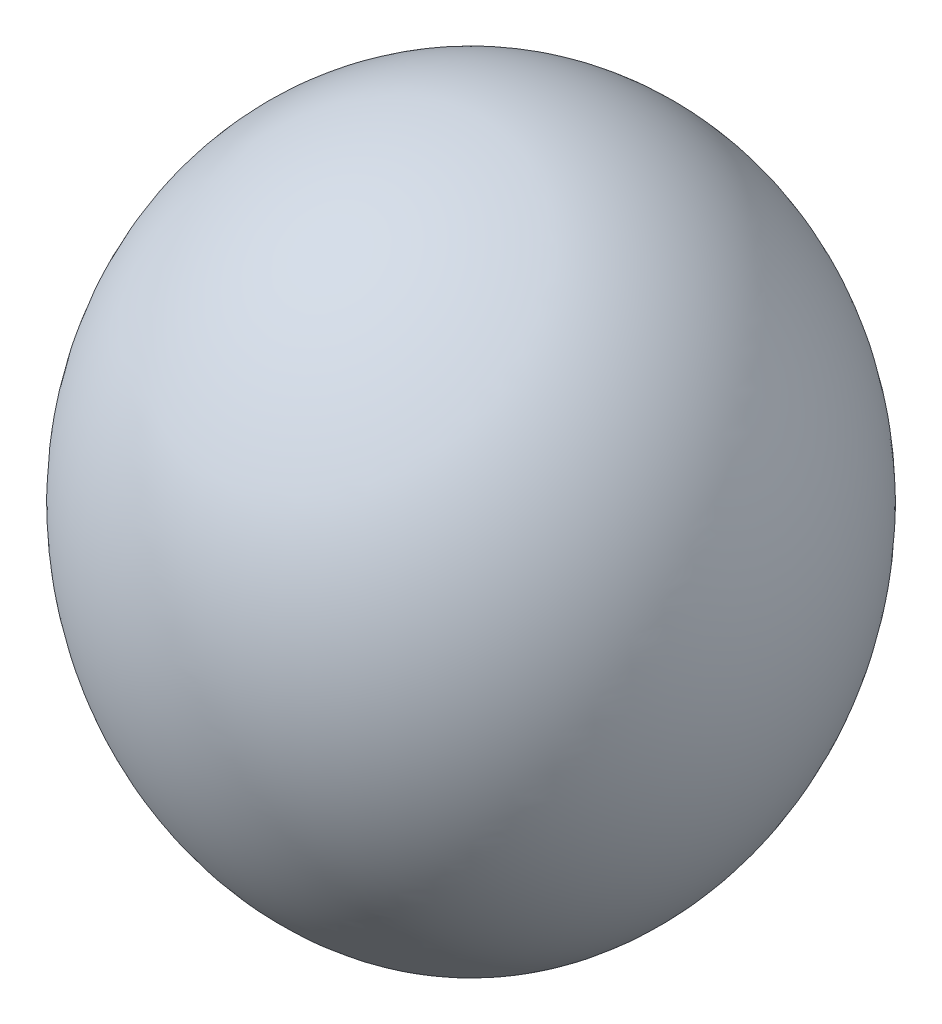
ISO-10303-21;
HEADER;
FILE_DESCRIPTION(('STEP AP214'),'2;1');
FILE_NAME('part.step','',(''),(''),'','','');
FILE_SCHEMA(('AUTOMOTIVE_DESIGN { 1 0 10303 214 1 1 1 1 }'));
ENDSEC;
DATA;
#1=APPLICATION_CONTEXT('core data for automotive mechanical design processes');
#2=APPLICATION_PROTOCOL_DEFINITION('international standard','automotive_design',2000,#1);
#3=PRODUCT_CONTEXT('',#1,'mechanical');
#4=PRODUCT('Part','Part','',(#3));
#5=PRODUCT_RELATED_PRODUCT_CATEGORY('part','',(#4));
#6=PRODUCT_DEFINITION_FORMATION('','',#4);
#7=PRODUCT_DEFINITION_CONTEXT('part definition',#1,'design');
#8=PRODUCT_DEFINITION('design','',#6,#7);
#9=PRODUCT_DEFINITION_SHAPE('','',#8);
#10=(LENGTH_UNIT() NAMED_UNIT(*) SI_UNIT(.MILLI.,.METRE.));
#11=(NAMED_UNIT(*) PLANE_ANGLE_UNIT() SI_UNIT($,.RADIAN.));
#12=(NAMED_UNIT(*) SI_UNIT($,.STERADIAN.) SOLID_ANGLE_UNIT());
#13=UNCERTAINTY_MEASURE_WITH_UNIT(LENGTH_MEASURE(1.E-05),#10,'distance_accuracy_value','');
#14=(GEOMETRIC_REPRESENTATION_CONTEXT(3) GLOBAL_UNCERTAINTY_ASSIGNED_CONTEXT((#13)) GLOBAL_UNIT_ASSIGNED_CONTEXT((#10,
#11,#12)) REPRESENTATION_CONTEXT('',''));
#15=CARTESIAN_POINT('',(0.,0.,0.));
#16=DIRECTION('',(0.,0.,1.));
#17=DIRECTION('',(1.,0.,0.));
#18=AXIS2_PLACEMENT_3D('',#15,#16,#17);
#19=CARTESIAN_POINT('',(1.41146710431532E-11,0.,0.));
#20=CARTESIAN_POINT('',(0.0859484376262017,-0.0282662684604244,0.));
#21=CARTESIAN_POINT('',(0.258741266043385,-0.0818126349667669,0.));
#22=CARTESIAN_POINT('',(0.607975906154392,-0.176773899432167,0.));
#23=CARTESIAN_POINT('',(1.13648443868247,-0.300694334369223,0.));
#24=CARTESIAN_POINT('',(1.75736046841581,-0.425492273985936,0.));
#25=CARTESIAN_POINT('',(2.47092487411519,-0.546444597975775,0.));
#26=CARTESIAN_POINT('',(3.18729849219299,-0.6491842073489,0.));
#27=CARTESIAN_POINT('',(3.90581284062354,-0.735687541069568,0.));
#28=CARTESIAN_POINT('',(4.62591371099559,-0.807603315987792,0.));
#29=CARTESIAN_POINT('',(5.76656639695076,-0.899989174711032,0.));
#30=CARTESIAN_POINT('',(7.32997146589355,-0.978373944070118,0.));
#31=CARTESIAN_POINT('',(9.31621460960801,-1.0015369923337,0.));
#32=CARTESIAN_POINT('',(11.7220271185774,-0.925628511429962,0.));
#33=CARTESIAN_POINT('',(14.3971716622839,-0.73790074574666,0.));
#34=CARTESIAN_POINT('',(17.3358932630275,-0.411989058645636,0.));
#35=CARTESIAN_POINT('',(20.5303576412977,0.0772355685000593,0.));
#36=CARTESIAN_POINT('',(23.9707996083012,0.753981371578221,0.));
#37=CARTESIAN_POINT('',(28.2347700624499,1.76756874603618,0.));
#38=CARTESIAN_POINT('',(33.2872704304692,3.23246337930188,0.));
#39=CARTESIAN_POINT('',(39.0780254717897,5.26931887182034,0.));
#40=CARTESIAN_POINT('',(45.539794960055,7.99882327547519,0.));
#41=CARTESIAN_POINT('',(53.1168259302294,11.7233962445402,0.));
#42=CARTESIAN_POINT('',(61.6611172805564,16.6752284001241,0.));
#43=CARTESIAN_POINT('',(74.1380836324685,25.2582387937832,0.));
#44=CARTESIAN_POINT('',(89.4923341094344,38.7566394707688,0.));
#45=CARTESIAN_POINT('',(105.334527051208,57.2109254431687,0.));
#46=CARTESIAN_POINT('',(120.029622867611,81.2294987615516,0.));
#47=CARTESIAN_POINT('',(130.843845704351,107.221766290394,0.));
#48=CARTESIAN_POINT('',(137.570745820491,134.558138538383,0.));
#49=CARTESIAN_POINT('',(140.025513533455,162.605947230255,0.));
#50=CARTESIAN_POINT('',(138.301043696831,187.186959393694,0.));
#51=CARTESIAN_POINT('',(133.992044155786,207.830556302757,0.));
#52=CARTESIAN_POINT('',(128.506752773258,224.498756482363,0.));
#53=CARTESIAN_POINT('',(122.98652847123,237.406769960268,0.));
#54=CARTESIAN_POINT('',(116.34720576717,249.777600476556,0.));
#55=CARTESIAN_POINT('',(109.579249051985,260.031141948827,0.));
#56=CARTESIAN_POINT('',(103.115808939633,268.337765834442,0.));
#57=CARTESIAN_POINT('',(96.1413567074445,276.213295476677,0.));
#58=CARTESIAN_POINT('',(88.6704255209011,283.627502930023,0.));
#59=CARTESIAN_POINT('',(79.671165034008,291.198206100322,0.));
#60=CARTESIAN_POINT('',(69.8927448485144,297.935366193862,0.));
#61=CARTESIAN_POINT('',(61.1222441539041,302.970615340565,0.));
#62=CARTESIAN_POINT('',(54.4052809333182,306.259537852515,0.));
#63=CARTESIAN_POINT('',(49.4752279922986,308.402261200091,0.));
#64=CARTESIAN_POINT('',(45.3967415433711,310.005002011626,0.));
#65=CARTESIAN_POINT('',(42.1007772880208,311.199361520453,0.));
#66=CARTESIAN_POINT('',(38.7739053085125,312.304684986551,0.));
#67=CARTESIAN_POINT('',(35.4184007172713,313.319846846936,0.));
#68=CARTESIAN_POINT('',(32.0366731147342,314.2438026592,0.));
#69=CARTESIAN_POINT('',(28.6310504400938,315.075592838871,0.));
#70=CARTESIAN_POINT('',(25.2041239903591,315.814346188175,0.));
#71=CARTESIAN_POINT('',(21.7581668819248,316.459283049553,0.));
#72=CARTESIAN_POINT('',(18.2960958721629,317.009718133361,0.));
#73=CARTESIAN_POINT('',(15.2543316251859,317.408144998869,0.));
#74=CARTESIAN_POINT('',(12.6407341636367,317.689916768168,0.));
#75=CARTESIAN_POINT('',(10.4579002422329,317.884780671021,0.));
#76=CARTESIAN_POINT('',(8.71145682890226,318.016662169121,0.));
#77=CARTESIAN_POINT('',(7.01718597563807,318.120951145697,0.));
#78=CARTESIAN_POINT('',(5.38617227190987,318.200188685147,0.));
#79=CARTESIAN_POINT('',(3.9899694364865,318.250002448526,0.));
#80=CARTESIAN_POINT('',(2.86155279063243,318.279563873678,0.));
#81=CARTESIAN_POINT('',(1.88839935742031,318.296619795261,0.));
#82=CARTESIAN_POINT('',(1.17505896639695,318.305716673976,0.));
#83=CARTESIAN_POINT('',(0.523129219152612,318.309128091201,0.));
#84=CARTESIAN_POINT('',(0.17295736899519,318.309886183791,0.));
#85=CARTESIAN_POINT('',(2.12969130492851E-11,318.309886183791,0.));
#86=B_SPLINE_CURVE_WITH_KNOTS('',4,(#19,#20,#21,#22,#23,#24,#25,#26,#27,#28,#29,#30,#31,#32,#33,
#34,#35,#36,#37,#38,#39,#40,#41,#42,#43,#44,#45,#46,#47,#48,#49,#50,#51,#52,#53,#54,#55,#56,#57,
#58,#59,#60,#61,#62,#63,#64,#65,#66,#67,#68,#69,#70,#71,#72,#73,#74,#75,#76,#77,#78,#79,#80,#81,
#82,#83,#84,#85),.UNSPECIFIED.,.F.,.F.,(5,1,1,1,1,1,1,1,1,1,1,1,1,1,1,1,1,1,1,1,1,1,1,1,1,1,1,1,
1,1,1,1,1,1,1,1,1,1,1,1,1,1,1,1,1,1,1,1,1,1,1,1,1,1,1,1,1,1,1,1,1,1,1,5),(0.,
0.000700683276676628,0.00140136655335326,0.00280273310670651,0.00420409966005977,
0.00560546621341302,0.00700683276676628,0.00840819932011953,0.00980956587347279,
0.011210932426826,0.0158709471347707,0.0205309618427154,0.0251909765506601,0.0298509912586048,
0.0366394053159713,0.0434278193733378,0.0502162334307044,0.0570046474880709,0.0705809872013024,
0.084157326914534,0.0977336932649558,0.111310059615378,0.135947468736871,0.160584877858364,
0.214889816252771,0.269194757123992,0.323499694564589,0.377804649046081,0.432109552594019,
0.486414487618962,0.540719415674479,0.567871876520598,0.595024337366718,0.622176786647345,
0.649329235927972,0.676481693932103,0.690057922934169,0.703634151936234,0.730786602148666,
0.757939052361099,0.781003168764148,0.795479323702256,0.80905555597644,0.815843672113531,
0.82263178376121,0.829419895408888,0.836208007056566,0.842996118704244,0.849784231243136,
0.856572343782029,0.863360456320921,0.870148568859813,0.876936683774392,0.883724798688972,
0.887118856146262,0.890512913603552,0.893906971060842,0.897301028518132,0.900248500978057,
0.903195973437981,0.904669709667943,0.906143445897905,0.907617182127867,0.90909091835783),.UNSPECIFIED.);
#87=CARTESIAN_POINT('',(1.59677390484893E-11,318.309886183791,0.));
#88=DIRECTION('',(0.,1.,0.));
#89=AXIS1_PLACEMENT('',#87,#88);
#90=SURFACE_OF_REVOLUTION('',#86,#89);
#91=CARTESIAN_POINT('',(1.59677390484893E-11,318.309886183791,0.));
#92=VERTEX_POINT('',#91);
#93=VERTEX_LOOP('',#92);
#94=FACE_BOUND('',#93,.T.);
#95=CARTESIAN_POINT('',(1.41146710431532E-11,0.,0.));
#96=VERTEX_POINT('',#95);
#97=VERTEX_LOOP('',#96);
#98=FACE_BOUND('',#97,.T.);
#99=ADVANCED_FACE('F40',(#94,#98),#90,.T.);
#100=CLOSED_SHELL('',(#99));
#101=MANIFOLD_SOLID_BREP('B2',#100);
#102=ADVANCED_BREP_SHAPE_REPRESENTATION('',(#18,#101),#14);
#103=SHAPE_DEFINITION_REPRESENTATION(#9,#102);
ENDSEC;
END-ISO-10303-21;
